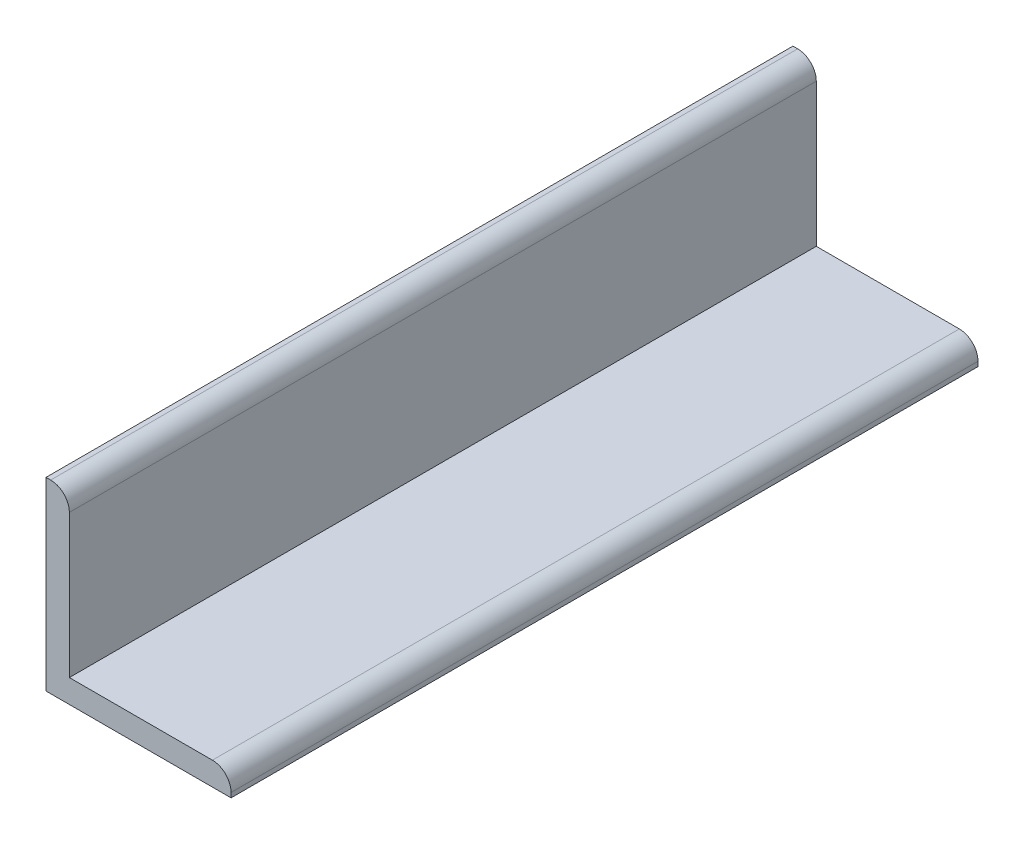
ISO-10303-21;
HEADER;
FILE_DESCRIPTION(('STEP AP214'),'2;1');
FILE_NAME('part.step','',(''),(''),'','','');
FILE_SCHEMA(('AUTOMOTIVE_DESIGN { 1 0 10303 214 1 1 1 1 }'));
ENDSEC;
DATA;
#1=APPLICATION_CONTEXT('core data for automotive mechanical design processes');
#2=APPLICATION_PROTOCOL_DEFINITION('international standard','automotive_design',2000,#1);
#3=PRODUCT_CONTEXT('',#1,'mechanical');
#4=PRODUCT('Part','Part','',(#3));
#5=PRODUCT_RELATED_PRODUCT_CATEGORY('part','',(#4));
#6=PRODUCT_DEFINITION_FORMATION('','',#4);
#7=PRODUCT_DEFINITION_CONTEXT('part definition',#1,'design');
#8=PRODUCT_DEFINITION('design','',#6,#7);
#9=PRODUCT_DEFINITION_SHAPE('','',#8);
#10=(LENGTH_UNIT() NAMED_UNIT(*) SI_UNIT(.MILLI.,.METRE.));
#11=(NAMED_UNIT(*) PLANE_ANGLE_UNIT() SI_UNIT($,.RADIAN.));
#12=(NAMED_UNIT(*) SI_UNIT($,.STERADIAN.) SOLID_ANGLE_UNIT());
#13=UNCERTAINTY_MEASURE_WITH_UNIT(LENGTH_MEASURE(1.E-05),#10,'distance_accuracy_value','');
#14=(GEOMETRIC_REPRESENTATION_CONTEXT(3) GLOBAL_UNCERTAINTY_ASSIGNED_CONTEXT((#13)) GLOBAL_UNIT_ASSIGNED_CONTEXT((#10,
#11,#12)) REPRESENTATION_CONTEXT('',''));
#15=CARTESIAN_POINT('',(0.,0.,0.));
#16=DIRECTION('',(0.,0.,1.));
#17=DIRECTION('',(1.,0.,0.));
#18=AXIS2_PLACEMENT_3D('',#15,#16,#17);
#19=CARTESIAN_POINT('',(1.27,45.2625762746505,203.2));
#20=DIRECTION('',(0.,0.,-1.));
#21=DIRECTION('',(-1.,0.,0.));
#22=AXIS2_PLACEMENT_3D('',#19,#20,#21);
#23=CYLINDRICAL_SURFACE('',#22,5.08);
#24=CARTESIAN_POINT('',(1.27,45.2625762746505,0.));
#25=DIRECTION('',(0.,0.,1.));
#26=DIRECTION('',(1.,0.,0.));
#27=AXIS2_PLACEMENT_3D('',#24,#25,#26);
#28=CIRCLE('',#27,5.08);
#29=CARTESIAN_POINT('',(1.26999999999997,50.3425762746505,0.));
#30=VERTEX_POINT('',#29);
#31=CARTESIAN_POINT('',(6.35,45.2625762746504,0.));
#32=VERTEX_POINT('',#31);
#33=EDGE_CURVE('E145',#30,#32,#28,.F.);
#34=ORIENTED_EDGE('',*,*,#33,.F.);
#35=DIRECTION('',(0.,0.,-1.));
#36=VECTOR('',#35,1.);
#37=CARTESIAN_POINT('',(1.26999999999997,50.3425762746505,203.2));
#38=LINE('',#37,#36);
#39=CARTESIAN_POINT('',(1.26999999999997,50.3425762746505,203.2));
#40=VERTEX_POINT('',#39);
#41=EDGE_CURVE('E11',#40,#30,#38,.T.);
#42=ORIENTED_EDGE('',*,*,#41,.F.);
#43=CARTESIAN_POINT('',(1.27,45.2625762746505,203.2));
#44=DIRECTION('',(0.,0.,1.));
#45=DIRECTION('',(1.,0.,0.));
#46=AXIS2_PLACEMENT_3D('',#43,#44,#45);
#47=CIRCLE('',#46,5.08);
#48=CARTESIAN_POINT('',(6.35,45.2625762746504,203.2));
#49=VERTEX_POINT('',#48);
#50=EDGE_CURVE('E171',#40,#49,#47,.F.);
#51=ORIENTED_EDGE('',*,*,#50,.T.);
#52=DIRECTION('',(0.,0.,-1.));
#53=VECTOR('',#52,1.);
#54=CARTESIAN_POINT('',(6.35,45.2625762746504,203.2));
#55=LINE('',#54,#53);
#56=EDGE_CURVE('E64',#49,#32,#55,.T.);
#57=ORIENTED_EDGE('',*,*,#56,.T.);
#58=EDGE_LOOP('',(#34,#42,#51,#57));
#59=FACE_BOUND('',#58,.T.);
#60=ADVANCED_FACE('F47',(#59),#23,.T.);
#61=CARTESIAN_POINT('',(0.,50.3425762746505,203.2));
#62=DIRECTION('',(0.,1.,0.));
#63=DIRECTION('',(0.,0.,1.));
#64=AXIS2_PLACEMENT_3D('',#61,#62,#63);
#65=PLANE('',#64);
#66=DIRECTION('',(1.,0.,0.));
#67=VECTOR('',#66,1.);
#68=CARTESIAN_POINT('',(0.,50.3425762746505,0.));
#69=LINE('',#68,#67);
#70=CARTESIAN_POINT('',(0.,50.3425762746505,0.));
#71=VERTEX_POINT('',#70);
#72=EDGE_CURVE('E148',#71,#30,#69,.T.);
#73=ORIENTED_EDGE('',*,*,#72,.F.);
#74=DIRECTION('',(0.,0.,-1.));
#75=VECTOR('',#74,1.);
#76=CARTESIAN_POINT('',(0.,50.3425762746505,203.2));
#77=LINE('',#76,#75);
#78=CARTESIAN_POINT('',(0.,50.3425762746505,203.2));
#79=VERTEX_POINT('',#78);
#80=EDGE_CURVE('E56',#79,#71,#77,.T.);
#81=ORIENTED_EDGE('',*,*,#80,.F.);
#82=DIRECTION('',(1.,0.,0.));
#83=VECTOR('',#82,1.);
#84=CARTESIAN_POINT('',(0.,50.3425762746505,203.2));
#85=LINE('',#84,#83);
#86=EDGE_CURVE('E213',#79,#40,#85,.T.);
#87=ORIENTED_EDGE('',*,*,#86,.T.);
#88=ORIENTED_EDGE('',*,*,#41,.T.);
#89=EDGE_LOOP('',(#73,#81,#87,#88));
#90=FACE_BOUND('',#89,.T.);
#91=ADVANCED_FACE('F195',(#90),#65,.T.);
#92=CARTESIAN_POINT('',(0.,0.,203.2));
#93=DIRECTION('',(-1.,0.,0.));
#94=DIRECTION('',(0.,0.,1.));
#95=AXIS2_PLACEMENT_3D('',#92,#93,#94);
#96=PLANE('',#95);
#97=DIRECTION('',(0.,1.,0.));
#98=VECTOR('',#97,1.);
#99=CARTESIAN_POINT('',(0.,0.,0.));
#100=LINE('',#99,#98);
#101=CARTESIAN_POINT('',(0.,0.,0.));
#102=VERTEX_POINT('',#101);
#103=EDGE_CURVE('E152',#102,#71,#100,.T.);
#104=ORIENTED_EDGE('',*,*,#103,.F.);
#105=DIRECTION('',(0.,0.,-1.));
#106=VECTOR('',#105,1.);
#107=CARTESIAN_POINT('',(0.,0.,203.2));
#108=LINE('',#107,#106);
#109=CARTESIAN_POINT('',(0.,0.,203.2));
#110=VERTEX_POINT('',#109);
#111=EDGE_CURVE('E182',#110,#102,#108,.T.);
#112=ORIENTED_EDGE('',*,*,#111,.F.);
#113=DIRECTION('',(0.,1.,0.));
#114=VECTOR('',#113,1.);
#115=CARTESIAN_POINT('',(0.,0.,203.2));
#116=LINE('',#115,#114);
#117=EDGE_CURVE('E191',#110,#79,#116,.T.);
#118=ORIENTED_EDGE('',*,*,#117,.T.);
#119=ORIENTED_EDGE('',*,*,#80,.T.);
#120=EDGE_LOOP('',(#104,#112,#118,#119));
#121=FACE_BOUND('',#120,.T.);
#122=ADVANCED_FACE('F189',(#121),#96,.T.);
#123=CARTESIAN_POINT('',(0.,0.,203.2));
#124=DIRECTION('',(0.,1.,0.));
#125=DIRECTION('',(0.,0.,1.));
#126=AXIS2_PLACEMENT_3D('',#123,#124,#125);
#127=PLANE('',#126);
#128=DIRECTION('',(1.,0.,0.));
#129=VECTOR('',#128,1.);
#130=CARTESIAN_POINT('',(0.,0.,0.));
#131=LINE('',#130,#129);
#132=CARTESIAN_POINT('',(50.3425762746505,0.,0.));
#133=VERTEX_POINT('',#132);
#134=EDGE_CURVE('E156',#102,#133,#131,.T.);
#135=ORIENTED_EDGE('',*,*,#134,.T.);
#136=DIRECTION('',(0.,0.,-1.));
#137=VECTOR('',#136,1.);
#138=CARTESIAN_POINT('',(50.3425762746505,0.,203.2));
#139=LINE('',#138,#137);
#140=CARTESIAN_POINT('',(50.3425762746505,0.,203.2));
#141=VERTEX_POINT('',#140);
#142=EDGE_CURVE('E178',#141,#133,#139,.T.);
#143=ORIENTED_EDGE('',*,*,#142,.F.);
#144=DIRECTION('',(1.,0.,0.));
#145=VECTOR('',#144,1.);
#146=CARTESIAN_POINT('',(0.,0.,203.2));
#147=LINE('',#146,#145);
#148=EDGE_CURVE('E207',#110,#141,#147,.T.);
#149=ORIENTED_EDGE('',*,*,#148,.F.);
#150=ORIENTED_EDGE('',*,*,#111,.T.);
#151=EDGE_LOOP('',(#135,#143,#149,#150));
#152=FACE_BOUND('',#151,.T.);
#153=ADVANCED_FACE('F202',(#152),#127,.F.);
#154=CARTESIAN_POINT('',(50.3425762746505,0.,203.2));
#155=DIRECTION('',(-1.,0.,0.));
#156=DIRECTION('',(0.,0.,1.));
#157=AXIS2_PLACEMENT_3D('',#154,#155,#156);
#158=PLANE('',#157);
#159=DIRECTION('',(0.,1.,0.));
#160=VECTOR('',#159,1.);
#161=CARTESIAN_POINT('',(50.3425762746505,0.,0.));
#162=LINE('',#161,#160);
#163=CARTESIAN_POINT('',(50.3425762746505,1.26999999999996,0.));
#164=VERTEX_POINT('',#163);
#165=EDGE_CURVE('E159',#133,#164,#162,.T.);
#166=ORIENTED_EDGE('',*,*,#165,.T.);
#167=DIRECTION('',(0.,0.,-1.));
#168=VECTOR('',#167,1.);
#169=CARTESIAN_POINT('',(50.3425762746505,1.26999999999996,203.2));
#170=LINE('',#169,#168);
#171=CARTESIAN_POINT('',(50.3425762746505,1.26999999999996,203.2));
#172=VERTEX_POINT('',#171);
#173=EDGE_CURVE('E135',#172,#164,#170,.T.);
#174=ORIENTED_EDGE('',*,*,#173,.F.);
#175=DIRECTION('',(0.,1.,0.));
#176=VECTOR('',#175,1.);
#177=CARTESIAN_POINT('',(50.3425762746505,0.,203.2));
#178=LINE('',#177,#176);
#179=EDGE_CURVE('E121',#141,#172,#178,.T.);
#180=ORIENTED_EDGE('',*,*,#179,.F.);
#181=ORIENTED_EDGE('',*,*,#142,.T.);
#182=EDGE_LOOP('',(#166,#174,#180,#181));
#183=FACE_BOUND('',#182,.T.);
#184=ADVANCED_FACE('F205',(#183),#158,.F.);
#185=CARTESIAN_POINT('',(45.2625762746505,1.27,203.2));
#186=DIRECTION('',(0.,0.,-1.));
#187=DIRECTION('',(-1.,0.,0.));
#188=AXIS2_PLACEMENT_3D('',#185,#186,#187);
#189=CYLINDRICAL_SURFACE('',#188,5.08);
#190=CARTESIAN_POINT('',(45.2625762746505,1.27,0.));
#191=DIRECTION('',(0.,0.,1.));
#192=DIRECTION('',(1.,0.,0.));
#193=AXIS2_PLACEMENT_3D('',#190,#191,#192);
#194=CIRCLE('',#193,5.08);
#195=CARTESIAN_POINT('',(45.2625762746504,6.35,0.));
#196=VERTEX_POINT('',#195);
#197=EDGE_CURVE('E131',#164,#196,#194,.T.);
#198=ORIENTED_EDGE('',*,*,#197,.T.);
#199=DIRECTION('',(0.,0.,-1.));
#200=VECTOR('',#199,1.);
#201=CARTESIAN_POINT('',(45.2625762746504,6.35,203.2));
#202=LINE('',#201,#200);
#203=CARTESIAN_POINT('',(45.2625762746504,6.35,203.2));
#204=VERTEX_POINT('',#203);
#205=EDGE_CURVE('E128',#204,#196,#202,.T.);
#206=ORIENTED_EDGE('',*,*,#205,.F.);
#207=CARTESIAN_POINT('',(45.2625762746505,1.27,203.2));
#208=DIRECTION('',(0.,0.,1.));
#209=DIRECTION('',(1.,0.,0.));
#210=AXIS2_PLACEMENT_3D('',#207,#208,#209);
#211=CIRCLE('',#210,5.08);
#212=EDGE_CURVE('E114',#172,#204,#211,.T.);
#213=ORIENTED_EDGE('',*,*,#212,.F.);
#214=ORIENTED_EDGE('',*,*,#173,.T.);
#215=EDGE_LOOP('',(#198,#206,#213,#214));
#216=FACE_BOUND('',#215,.T.);
#217=ADVANCED_FACE('F129',(#216),#189,.T.);
#218=CARTESIAN_POINT('',(0.,6.34999999999999,203.2));
#219=DIRECTION('',(0.,-1.,0.));
#220=DIRECTION('',(1.,0.,0.));
#221=AXIS2_PLACEMENT_3D('',#218,#219,#220);
#222=PLANE('',#221);
#223=DIRECTION('',(-1.,0.,0.));
#224=VECTOR('',#223,1.);
#225=CARTESIAN_POINT('',(0.,6.34999999999999,0.));
#226=LINE('',#225,#224);
#227=CARTESIAN_POINT('',(6.35000000000001,6.34999999999999,0.));
#228=VERTEX_POINT('',#227);
#229=EDGE_CURVE('E164',#196,#228,#226,.T.);
#230=ORIENTED_EDGE('',*,*,#229,.T.);
#231=DIRECTION('',(0.,0.,-1.));
#232=VECTOR('',#231,1.);
#233=CARTESIAN_POINT('',(6.35000000000001,6.34999999999999,203.2));
#234=LINE('',#233,#232);
#235=CARTESIAN_POINT('',(6.35000000000001,6.34999999999999,203.2));
#236=VERTEX_POINT('',#235);
#237=EDGE_CURVE('E90',#236,#228,#234,.T.);
#238=ORIENTED_EDGE('',*,*,#237,.F.);
#239=DIRECTION('',(-1.,0.,0.));
#240=VECTOR('',#239,1.);
#241=CARTESIAN_POINT('',(0.,6.34999999999999,203.2));
#242=LINE('',#241,#240);
#243=EDGE_CURVE('E119',#204,#236,#242,.T.);
#244=ORIENTED_EDGE('',*,*,#243,.F.);
#245=ORIENTED_EDGE('',*,*,#205,.T.);
#246=EDGE_LOOP('',(#230,#238,#244,#245));
#247=FACE_BOUND('',#246,.T.);
#248=ADVANCED_FACE('F137',(#247),#222,.F.);
#249=CARTESIAN_POINT('',(6.35000000000001,0.,203.2));
#250=DIRECTION('',(1.,0.,0.));
#251=DIRECTION('',(0.,1.,0.));
#252=AXIS2_PLACEMENT_3D('',#249,#250,#251);
#253=PLANE('',#252);
#254=DIRECTION('',(0.,-1.,0.));
#255=VECTOR('',#254,1.);
#256=CARTESIAN_POINT('',(6.35000000000001,0.,0.));
#257=LINE('',#256,#255);
#258=EDGE_CURVE('E167',#32,#228,#257,.T.);
#259=ORIENTED_EDGE('',*,*,#258,.F.);
#260=ORIENTED_EDGE('',*,*,#56,.F.);
#261=DIRECTION('',(0.,-1.,0.));
#262=VECTOR('',#261,1.);
#263=CARTESIAN_POINT('',(6.35000000000001,0.,203.2));
#264=LINE('',#263,#262);
#265=EDGE_CURVE('E139',#49,#236,#264,.T.);
#266=ORIENTED_EDGE('',*,*,#265,.T.);
#267=ORIENTED_EDGE('',*,*,#237,.T.);
#268=EDGE_LOOP('',(#259,#260,#266,#267));
#269=FACE_BOUND('',#268,.T.);
#270=ADVANCED_FACE('F217',(#269),#253,.T.);
#271=CARTESIAN_POINT('',(0.,0.,203.2));
#272=DIRECTION('',(0.,0.,1.));
#273=DIRECTION('',(1.,0.,0.));
#274=AXIS2_PLACEMENT_3D('',#271,#272,#273);
#275=PLANE('',#274);
#276=ORIENTED_EDGE('',*,*,#50,.F.);
#277=ORIENTED_EDGE('',*,*,#86,.F.);
#278=ORIENTED_EDGE('',*,*,#117,.F.);
#279=ORIENTED_EDGE('',*,*,#148,.T.);
#280=ORIENTED_EDGE('',*,*,#179,.T.);
#281=ORIENTED_EDGE('',*,*,#212,.T.);
#282=ORIENTED_EDGE('',*,*,#243,.T.);
#283=ORIENTED_EDGE('',*,*,#265,.F.);
#284=EDGE_LOOP('',(#276,#277,#278,#279,#280,#281,#282,#283));
#285=FACE_BOUND('',#284,.T.);
#286=ADVANCED_FACE('F116',(#285),#275,.T.);
#287=CARTESIAN_POINT('',(0.,0.,0.));
#288=DIRECTION('',(0.,0.,1.));
#289=DIRECTION('',(1.,0.,0.));
#290=AXIS2_PLACEMENT_3D('',#287,#288,#289);
#291=PLANE('',#290);
#292=ORIENTED_EDGE('',*,*,#33,.T.);
#293=ORIENTED_EDGE('',*,*,#258,.T.);
#294=ORIENTED_EDGE('',*,*,#229,.F.);
#295=ORIENTED_EDGE('',*,*,#197,.F.);
#296=ORIENTED_EDGE('',*,*,#165,.F.);
#297=ORIENTED_EDGE('',*,*,#134,.F.);
#298=ORIENTED_EDGE('',*,*,#103,.T.);
#299=ORIENTED_EDGE('',*,*,#72,.T.);
#300=EDGE_LOOP('',(#292,#293,#294,#295,#296,#297,#298,#299));
#301=FACE_BOUND('',#300,.T.);
#302=ADVANCED_FACE('F198',(#301),#291,.F.);
#303=CLOSED_SHELL('',(#60,#91,#122,#153,#184,#217,#248,#270,#286,#302));
#304=MANIFOLD_SOLID_BREP('B2',#303);
#305=ADVANCED_BREP_SHAPE_REPRESENTATION('',(#18,#304),#14);
#306=SHAPE_DEFINITION_REPRESENTATION(#9,#305);
ENDSEC;
END-ISO-10303-21;
